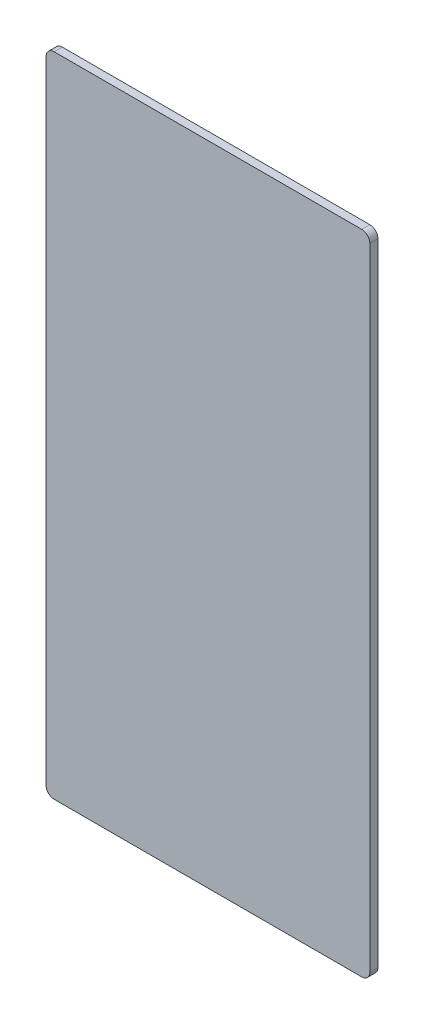
ISO-10303-21;
HEADER;
FILE_DESCRIPTION(('STEP AP214'),'2;1');
FILE_NAME('part.step','',(''),(''),'','','');
FILE_SCHEMA(('AUTOMOTIVE_DESIGN { 1 0 10303 214 1 1 1 1 }'));
ENDSEC;
DATA;
#1=APPLICATION_CONTEXT('core data for automotive mechanical design processes');
#2=APPLICATION_PROTOCOL_DEFINITION('international standard','automotive_design',2000,#1);
#3=PRODUCT_CONTEXT('',#1,'mechanical');
#4=PRODUCT('Part','Part','',(#3));
#5=PRODUCT_RELATED_PRODUCT_CATEGORY('part','',(#4));
#6=PRODUCT_DEFINITION_FORMATION('','',#4);
#7=PRODUCT_DEFINITION_CONTEXT('part definition',#1,'design');
#8=PRODUCT_DEFINITION('design','',#6,#7);
#9=PRODUCT_DEFINITION_SHAPE('','',#8);
#10=(LENGTH_UNIT() NAMED_UNIT(*) SI_UNIT(.MILLI.,.METRE.));
#11=(NAMED_UNIT(*) PLANE_ANGLE_UNIT() SI_UNIT($,.RADIAN.));
#12=(NAMED_UNIT(*) SI_UNIT($,.STERADIAN.) SOLID_ANGLE_UNIT());
#13=UNCERTAINTY_MEASURE_WITH_UNIT(LENGTH_MEASURE(1.E-05),#10,'distance_accuracy_value','');
#14=(GEOMETRIC_REPRESENTATION_CONTEXT(3) GLOBAL_UNCERTAINTY_ASSIGNED_CONTEXT((#13)) GLOBAL_UNIT_ASSIGNED_CONTEXT((#10,
#11,#12)) REPRESENTATION_CONTEXT('',''));
#15=CARTESIAN_POINT('',(0.,0.,0.));
#16=DIRECTION('',(0.,0.,1.));
#17=DIRECTION('',(1.,0.,0.));
#18=AXIS2_PLACEMENT_3D('',#15,#16,#17);
#19=CARTESIAN_POINT('',(10.,-20.,0.5));
#20=DIRECTION('',(-1.,0.,0.));
#21=DIRECTION('',(0.,0.,1.));
#22=AXIS2_PLACEMENT_3D('',#19,#20,#21);
#23=PLANE('',#22);
#24=DIRECTION('',(0.,1.,0.));
#25=VECTOR('',#24,1.);
#26=CARTESIAN_POINT('',(10.,-20.,0.));
#27=LINE('',#26,#25);
#28=CARTESIAN_POINT('',(10.,-19.5,0.));
#29=VERTEX_POINT('',#28);
#30=CARTESIAN_POINT('',(10.,19.5,0.));
#31=VERTEX_POINT('',#30);
#32=EDGE_CURVE('E155',#29,#31,#27,.T.);
#33=ORIENTED_EDGE('',*,*,#32,.T.);
#34=DIRECTION('',(0.,0.,-1.));
#35=VECTOR('',#34,1.);
#36=CARTESIAN_POINT('',(10.,19.5,0.5));
#37=LINE('',#36,#35);
#38=CARTESIAN_POINT('',(10.,19.5,0.5));
#39=VERTEX_POINT('',#38);
#40=EDGE_CURVE('E197',#31,#39,#37,.F.);
#41=ORIENTED_EDGE('',*,*,#40,.T.);
#42=DIRECTION('',(0.,1.,0.));
#43=VECTOR('',#42,1.);
#44=CARTESIAN_POINT('',(10.,-20.,0.5));
#45=LINE('',#44,#43);
#46=CARTESIAN_POINT('',(10.,-19.5,0.5));
#47=VERTEX_POINT('',#46);
#48=EDGE_CURVE('E164',#47,#39,#45,.T.);
#49=ORIENTED_EDGE('',*,*,#48,.F.);
#50=DIRECTION('',(0.,0.,-1.));
#51=VECTOR('',#50,1.);
#52=CARTESIAN_POINT('',(10.,-19.5,0.5));
#53=LINE('',#52,#51);
#54=EDGE_CURVE('E194',#47,#29,#53,.T.);
#55=ORIENTED_EDGE('',*,*,#54,.T.);
#56=EDGE_LOOP('',(#33,#41,#49,#55));
#57=FACE_BOUND('',#56,.T.);
#58=ADVANCED_FACE('F41',(#57),#23,.F.);
#59=CARTESIAN_POINT('',(-10.,20.,0.5));
#60=DIRECTION('',(0.,-1.,0.));
#61=DIRECTION('',(0.,0.,-1.));
#62=AXIS2_PLACEMENT_3D('',#59,#60,#61);
#63=PLANE('',#62);
#64=DIRECTION('',(-1.,0.,0.));
#65=VECTOR('',#64,1.);
#66=CARTESIAN_POINT('',(-10.,20.,0.5));
#67=LINE('',#66,#65);
#68=CARTESIAN_POINT('',(9.5,20.,0.5));
#69=VERTEX_POINT('',#68);
#70=CARTESIAN_POINT('',(-9.5,20.,0.5));
#71=VERTEX_POINT('',#70);
#72=EDGE_CURVE('E167',#69,#71,#67,.T.);
#73=ORIENTED_EDGE('',*,*,#72,.F.);
#74=DIRECTION('',(0.,0.,-1.));
#75=VECTOR('',#74,1.);
#76=CARTESIAN_POINT('',(9.5,20.,0.5));
#77=LINE('',#76,#75);
#78=CARTESIAN_POINT('',(9.5,20.,0.));
#79=VERTEX_POINT('',#78);
#80=EDGE_CURVE('E183',#69,#79,#77,.T.);
#81=ORIENTED_EDGE('',*,*,#80,.T.);
#82=DIRECTION('',(-1.,0.,0.));
#83=VECTOR('',#82,1.);
#84=CARTESIAN_POINT('',(-10.,20.,0.));
#85=LINE('',#84,#83);
#86=CARTESIAN_POINT('',(-9.5,20.,0.));
#87=VERTEX_POINT('',#86);
#88=EDGE_CURVE('E158',#79,#87,#85,.T.);
#89=ORIENTED_EDGE('',*,*,#88,.T.);
#90=DIRECTION('',(0.,0.,-1.));
#91=VECTOR('',#90,1.);
#92=CARTESIAN_POINT('',(-9.5,20.,0.5));
#93=LINE('',#92,#91);
#94=EDGE_CURVE('E174',#87,#71,#93,.F.);
#95=ORIENTED_EDGE('',*,*,#94,.T.);
#96=EDGE_LOOP('',(#73,#81,#89,#95));
#97=FACE_BOUND('',#96,.T.);
#98=ADVANCED_FACE('F234',(#97),#63,.F.);
#99=CARTESIAN_POINT('',(-10.,-20.,0.5));
#100=DIRECTION('',(1.,0.,0.));
#101=DIRECTION('',(0.,0.,-1.));
#102=AXIS2_PLACEMENT_3D('',#99,#100,#101);
#103=PLANE('',#102);
#104=DIRECTION('',(0.,-1.,0.));
#105=VECTOR('',#104,1.);
#106=CARTESIAN_POINT('',(-10.,-20.,0.5));
#107=LINE('',#106,#105);
#108=CARTESIAN_POINT('',(-10.,19.5,0.5));
#109=VERTEX_POINT('',#108);
#110=CARTESIAN_POINT('',(-10.,-19.5,0.5));
#111=VERTEX_POINT('',#110);
#112=EDGE_CURVE('E171',#109,#111,#107,.T.);
#113=ORIENTED_EDGE('',*,*,#112,.F.);
#114=DIRECTION('',(0.,0.,-1.));
#115=VECTOR('',#114,1.);
#116=CARTESIAN_POINT('',(-10.,19.5,0.5));
#117=LINE('',#116,#115);
#118=CARTESIAN_POINT('',(-10.,19.5,0.));
#119=VERTEX_POINT('',#118);
#120=EDGE_CURVE('E208',#109,#119,#117,.T.);
#121=ORIENTED_EDGE('',*,*,#120,.T.);
#122=DIRECTION('',(0.,-1.,0.));
#123=VECTOR('',#122,1.);
#124=CARTESIAN_POINT('',(-10.,-20.,0.));
#125=LINE('',#124,#123);
#126=CARTESIAN_POINT('',(-10.,-19.5,0.));
#127=VERTEX_POINT('',#126);
#128=EDGE_CURVE('E178',#119,#127,#125,.T.);
#129=ORIENTED_EDGE('',*,*,#128,.T.);
#130=DIRECTION('',(0.,0.,-1.));
#131=VECTOR('',#130,1.);
#132=CARTESIAN_POINT('',(-10.,-19.5,0.5));
#133=LINE('',#132,#131);
#134=EDGE_CURVE('E206',#127,#111,#133,.F.);
#135=ORIENTED_EDGE('',*,*,#134,.T.);
#136=EDGE_LOOP('',(#113,#121,#129,#135));
#137=FACE_BOUND('',#136,.T.);
#138=ADVANCED_FACE('F242',(#137),#103,.F.);
#139=CARTESIAN_POINT('',(-10.,-20.,0.5));
#140=DIRECTION('',(0.,1.,0.));
#141=DIRECTION('',(0.,0.,1.));
#142=AXIS2_PLACEMENT_3D('',#139,#140,#141);
#143=PLANE('',#142);
#144=DIRECTION('',(1.,0.,0.));
#145=VECTOR('',#144,1.);
#146=CARTESIAN_POINT('',(-10.,-20.,0.));
#147=LINE('',#146,#145);
#148=CARTESIAN_POINT('',(-9.5,-20.,0.));
#149=VERTEX_POINT('',#148);
#150=CARTESIAN_POINT('',(9.5,-20.,0.));
#151=VERTEX_POINT('',#150);
#152=EDGE_CURVE('E168',#149,#151,#147,.T.);
#153=ORIENTED_EDGE('',*,*,#152,.T.);
#154=DIRECTION('',(0.,0.,-1.));
#155=VECTOR('',#154,1.);
#156=CARTESIAN_POINT('',(9.5,-20.,0.5));
#157=LINE('',#156,#155);
#158=CARTESIAN_POINT('',(9.5,-20.,0.5));
#159=VERTEX_POINT('',#158);
#160=EDGE_CURVE('E11',#151,#159,#157,.F.);
#161=ORIENTED_EDGE('',*,*,#160,.T.);
#162=DIRECTION('',(1.,0.,0.));
#163=VECTOR('',#162,1.);
#164=CARTESIAN_POINT('',(-10.,-20.,0.5));
#165=LINE('',#164,#163);
#166=CARTESIAN_POINT('',(-9.5,-20.,0.5));
#167=VERTEX_POINT('',#166);
#168=EDGE_CURVE('E173',#167,#159,#165,.T.);
#169=ORIENTED_EDGE('',*,*,#168,.F.);
#170=DIRECTION('',(0.,0.,-1.));
#171=VECTOR('',#170,1.);
#172=CARTESIAN_POINT('',(-9.5,-20.,0.5));
#173=LINE('',#172,#171);
#174=EDGE_CURVE('E49',#167,#149,#173,.T.);
#175=ORIENTED_EDGE('',*,*,#174,.T.);
#176=EDGE_LOOP('',(#153,#161,#169,#175));
#177=FACE_BOUND('',#176,.T.);
#178=ADVANCED_FACE('F213',(#177),#143,.F.);
#179=CARTESIAN_POINT('',(0.,0.,0.5));
#180=DIRECTION('',(0.,0.,-1.));
#181=DIRECTION('',(-1.,0.,0.));
#182=AXIS2_PLACEMENT_3D('',#179,#180,#181);
#183=PLANE('',#182);
#184=ORIENTED_EDGE('',*,*,#48,.T.);
#185=CARTESIAN_POINT('',(9.5,19.5,0.5));
#186=DIRECTION('',(0.,0.,-1.));
#187=DIRECTION('',(-1.,0.,0.));
#188=AXIS2_PLACEMENT_3D('',#185,#186,#187);
#189=CIRCLE('',#188,0.5);
#190=EDGE_CURVE('E204',#39,#69,#189,.F.);
#191=ORIENTED_EDGE('',*,*,#190,.T.);
#192=ORIENTED_EDGE('',*,*,#72,.T.);
#193=CARTESIAN_POINT('',(-9.5,19.5,0.5));
#194=DIRECTION('',(0.,0.,-1.));
#195=DIRECTION('',(-1.,0.,0.));
#196=AXIS2_PLACEMENT_3D('',#193,#194,#195);
#197=CIRCLE('',#196,0.5);
#198=EDGE_CURVE('E202',#71,#109,#197,.F.);
#199=ORIENTED_EDGE('',*,*,#198,.T.);
#200=ORIENTED_EDGE('',*,*,#112,.T.);
#201=CARTESIAN_POINT('',(-9.5,-19.5,0.5));
#202=DIRECTION('',(0.,0.,-1.));
#203=DIRECTION('',(-1.,0.,0.));
#204=AXIS2_PLACEMENT_3D('',#201,#202,#203);
#205=CIRCLE('',#204,0.5);
#206=EDGE_CURVE('E61',#111,#167,#205,.F.);
#207=ORIENTED_EDGE('',*,*,#206,.T.);
#208=ORIENTED_EDGE('',*,*,#168,.T.);
#209=CARTESIAN_POINT('',(9.5,-19.5,0.5));
#210=DIRECTION('',(0.,0.,-1.));
#211=DIRECTION('',(-1.,0.,0.));
#212=AXIS2_PLACEMENT_3D('',#209,#210,#211);
#213=CIRCLE('',#212,0.5);
#214=EDGE_CURVE('E200',#159,#47,#213,.F.);
#215=ORIENTED_EDGE('',*,*,#214,.T.);
#216=EDGE_LOOP('',(#184,#191,#192,#199,#200,#207,#208,#215));
#217=FACE_BOUND('',#216,.T.);
#218=ADVANCED_FACE('F228',(#217),#183,.F.);
#219=CARTESIAN_POINT('',(0.,0.,0.));
#220=DIRECTION('',(0.,0.,-1.));
#221=DIRECTION('',(-1.,0.,0.));
#222=AXIS2_PLACEMENT_3D('',#219,#220,#221);
#223=PLANE('',#222);
#224=DIRECTION('',(0.,1.,0.));
#225=VECTOR('',#224,1.);
#226=CARTESIAN_POINT('',(-9.,-19.,0.));
#227=LINE('',#226,#225);
#228=CARTESIAN_POINT('',(-9.,-19.,0.));
#229=VERTEX_POINT('',#228);
#230=CARTESIAN_POINT('',(-9.,19.,0.));
#231=VERTEX_POINT('',#230);
#232=EDGE_CURVE('E154',#229,#231,#227,.T.);
#233=ORIENTED_EDGE('',*,*,#232,.F.);
#234=DIRECTION('',(-1.,0.,0.));
#235=VECTOR('',#234,1.);
#236=CARTESIAN_POINT('',(9.,-19.,0.));
#237=LINE('',#236,#235);
#238=CARTESIAN_POINT('',(9.,-19.,0.));
#239=VERTEX_POINT('',#238);
#240=EDGE_CURVE('E151',#239,#229,#237,.T.);
#241=ORIENTED_EDGE('',*,*,#240,.F.);
#242=DIRECTION('',(0.,-1.,0.));
#243=VECTOR('',#242,1.);
#244=CARTESIAN_POINT('',(9.,-19.,0.));
#245=LINE('',#244,#243);
#246=CARTESIAN_POINT('',(9.,19.,0.));
#247=VERTEX_POINT('',#246);
#248=EDGE_CURVE('E369',#247,#239,#245,.T.);
#249=ORIENTED_EDGE('',*,*,#248,.F.);
#250=DIRECTION('',(1.,0.,0.));
#251=VECTOR('',#250,1.);
#252=CARTESIAN_POINT('',(9.,19.,0.));
#253=LINE('',#252,#251);
#254=EDGE_CURVE('E364',#231,#247,#253,.T.);
#255=ORIENTED_EDGE('',*,*,#254,.F.);
#256=EDGE_LOOP('',(#233,#241,#249,#255));
#257=FACE_BOUND('',#256,.T.);
#258=ORIENTED_EDGE('',*,*,#88,.F.);
#259=CARTESIAN_POINT('',(9.5,19.5,0.));
#260=DIRECTION('',(0.,0.,-1.));
#261=DIRECTION('',(-1.,0.,0.));
#262=AXIS2_PLACEMENT_3D('',#259,#260,#261);
#263=CIRCLE('',#262,0.5);
#264=EDGE_CURVE('E192',#79,#31,#263,.T.);
#265=ORIENTED_EDGE('',*,*,#264,.T.);
#266=ORIENTED_EDGE('',*,*,#32,.F.);
#267=CARTESIAN_POINT('',(9.5,-19.5,0.));
#268=DIRECTION('',(0.,0.,-1.));
#269=DIRECTION('',(-1.,0.,0.));
#270=AXIS2_PLACEMENT_3D('',#267,#268,#269);
#271=CIRCLE('',#270,0.5);
#272=EDGE_CURVE('E188',#29,#151,#271,.T.);
#273=ORIENTED_EDGE('',*,*,#272,.T.);
#274=ORIENTED_EDGE('',*,*,#152,.F.);
#275=CARTESIAN_POINT('',(-9.5,-19.5,0.));
#276=DIRECTION('',(0.,0.,-1.));
#277=DIRECTION('',(-1.,0.,0.));
#278=AXIS2_PLACEMENT_3D('',#275,#276,#277);
#279=CIRCLE('',#278,0.5);
#280=EDGE_CURVE('E186',#149,#127,#279,.T.);
#281=ORIENTED_EDGE('',*,*,#280,.T.);
#282=ORIENTED_EDGE('',*,*,#128,.F.);
#283=CARTESIAN_POINT('',(-9.5,19.5,0.));
#284=DIRECTION('',(0.,0.,-1.));
#285=DIRECTION('',(-1.,0.,0.));
#286=AXIS2_PLACEMENT_3D('',#283,#284,#285);
#287=CIRCLE('',#286,0.5);
#288=EDGE_CURVE('E190',#119,#87,#287,.T.);
#289=ORIENTED_EDGE('',*,*,#288,.T.);
#290=EDGE_LOOP('',(#258,#265,#266,#273,#274,#281,#282,#289));
#291=FACE_BOUND('',#290,.T.);
#292=ADVANCED_FACE('F217',(#257,#291),#223,.T.);
#293=CARTESIAN_POINT('',(-9.,-19.,-0.5));
#294=DIRECTION('',(1.,0.,0.));
#295=DIRECTION('',(0.,0.,-1.));
#296=AXIS2_PLACEMENT_3D('',#293,#294,#295);
#297=PLANE('',#296);
#298=ORIENTED_EDGE('',*,*,#232,.T.);
#299=DIRECTION('',(0.,0.,1.));
#300=VECTOR('',#299,1.);
#301=CARTESIAN_POINT('',(-9.,19.,-0.5));
#302=LINE('',#301,#300);
#303=CARTESIAN_POINT('',(-9.,19.,-0.5));
#304=VERTEX_POINT('',#303);
#305=EDGE_CURVE('E135',#304,#231,#302,.T.);
#306=ORIENTED_EDGE('',*,*,#305,.F.);
#307=DIRECTION('',(0.,1.,0.));
#308=VECTOR('',#307,1.);
#309=CARTESIAN_POINT('',(-9.,-19.,-0.5));
#310=LINE('',#309,#308);
#311=CARTESIAN_POINT('',(-9.,-19.,-0.5));
#312=VERTEX_POINT('',#311);
#313=EDGE_CURVE('E142',#312,#304,#310,.T.);
#314=ORIENTED_EDGE('',*,*,#313,.F.);
#315=DIRECTION('',(0.,0.,1.));
#316=VECTOR('',#315,1.);
#317=CARTESIAN_POINT('',(-9.,-19.,-0.5));
#318=LINE('',#317,#316);
#319=EDGE_CURVE('E367',#312,#229,#318,.T.);
#320=ORIENTED_EDGE('',*,*,#319,.T.);
#321=EDGE_LOOP('',(#298,#306,#314,#320));
#322=FACE_BOUND('',#321,.T.);
#323=ADVANCED_FACE('F153',(#322),#297,.F.);
#324=CARTESIAN_POINT('',(9.,19.,-0.5));
#325=DIRECTION('',(0.,-1.,0.));
#326=DIRECTION('',(0.,0.,-1.));
#327=AXIS2_PLACEMENT_3D('',#324,#325,#326);
#328=PLANE('',#327);
#329=ORIENTED_EDGE('',*,*,#254,.T.);
#330=DIRECTION('',(0.,0.,1.));
#331=VECTOR('',#330,1.);
#332=CARTESIAN_POINT('',(9.,19.,-0.5));
#333=LINE('',#332,#331);
#334=CARTESIAN_POINT('',(9.,19.,-0.5));
#335=VERTEX_POINT('',#334);
#336=EDGE_CURVE('E138',#335,#247,#333,.T.);
#337=ORIENTED_EDGE('',*,*,#336,.F.);
#338=DIRECTION('',(1.,0.,0.));
#339=VECTOR('',#338,1.);
#340=CARTESIAN_POINT('',(9.,19.,-0.5));
#341=LINE('',#340,#339);
#342=EDGE_CURVE('E130',#304,#335,#341,.T.);
#343=ORIENTED_EDGE('',*,*,#342,.F.);
#344=ORIENTED_EDGE('',*,*,#305,.T.);
#345=EDGE_LOOP('',(#329,#337,#343,#344));
#346=FACE_BOUND('',#345,.T.);
#347=ADVANCED_FACE('F133',(#346),#328,.F.);
#348=CARTESIAN_POINT('',(9.,-19.,-0.5));
#349=DIRECTION('',(-1.,0.,0.));
#350=DIRECTION('',(0.,0.,1.));
#351=AXIS2_PLACEMENT_3D('',#348,#349,#350);
#352=PLANE('',#351);
#353=ORIENTED_EDGE('',*,*,#248,.T.);
#354=DIRECTION('',(0.,0.,1.));
#355=VECTOR('',#354,1.);
#356=CARTESIAN_POINT('',(9.,-19.,-0.5));
#357=LINE('',#356,#355);
#358=CARTESIAN_POINT('',(9.,-19.,-0.5));
#359=VERTEX_POINT('',#358);
#360=EDGE_CURVE('E160',#359,#239,#357,.T.);
#361=ORIENTED_EDGE('',*,*,#360,.F.);
#362=DIRECTION('',(0.,-1.,0.));
#363=VECTOR('',#362,1.);
#364=CARTESIAN_POINT('',(9.,-19.,-0.5));
#365=LINE('',#364,#363);
#366=EDGE_CURVE('E141',#335,#359,#365,.T.);
#367=ORIENTED_EDGE('',*,*,#366,.F.);
#368=ORIENTED_EDGE('',*,*,#336,.T.);
#369=EDGE_LOOP('',(#353,#361,#367,#368));
#370=FACE_BOUND('',#369,.T.);
#371=ADVANCED_FACE('F295',(#370),#352,.F.);
#372=CARTESIAN_POINT('',(9.,-19.,-0.5));
#373=DIRECTION('',(0.,1.,0.));
#374=DIRECTION('',(0.,0.,1.));
#375=AXIS2_PLACEMENT_3D('',#372,#373,#374);
#376=PLANE('',#375);
#377=ORIENTED_EDGE('',*,*,#240,.T.);
#378=ORIENTED_EDGE('',*,*,#319,.F.);
#379=DIRECTION('',(-1.,0.,0.));
#380=VECTOR('',#379,1.);
#381=CARTESIAN_POINT('',(9.,-19.,-0.5));
#382=LINE('',#381,#380);
#383=EDGE_CURVE('E147',#359,#312,#382,.T.);
#384=ORIENTED_EDGE('',*,*,#383,.F.);
#385=ORIENTED_EDGE('',*,*,#360,.T.);
#386=EDGE_LOOP('',(#377,#378,#384,#385));
#387=FACE_BOUND('',#386,.T.);
#388=ADVANCED_FACE('F287',(#387),#376,.F.);
#389=CARTESIAN_POINT('',(0.,0.,-0.5));
#390=DIRECTION('',(0.,0.,1.));
#391=DIRECTION('',(1.,0.,0.));
#392=AXIS2_PLACEMENT_3D('',#389,#390,#391);
#393=PLANE('',#392);
#394=ORIENTED_EDGE('',*,*,#313,.T.);
#395=ORIENTED_EDGE('',*,*,#342,.T.);
#396=ORIENTED_EDGE('',*,*,#366,.T.);
#397=ORIENTED_EDGE('',*,*,#383,.T.);
#398=EDGE_LOOP('',(#394,#395,#396,#397));
#399=FACE_BOUND('',#398,.T.);
#400=ADVANCED_FACE('F145',(#399),#393,.F.);
#401=CARTESIAN_POINT('',(9.5,19.5,0.5));
#402=DIRECTION('',(0.,0.,-1.));
#403=DIRECTION('',(-1.,0.,0.));
#404=AXIS2_PLACEMENT_3D('',#401,#402,#403);
#405=CYLINDRICAL_SURFACE('',#404,0.5);
#406=ORIENTED_EDGE('',*,*,#190,.F.);
#407=ORIENTED_EDGE('',*,*,#40,.F.);
#408=ORIENTED_EDGE('',*,*,#264,.F.);
#409=ORIENTED_EDGE('',*,*,#80,.F.);
#410=EDGE_LOOP('',(#406,#407,#408,#409));
#411=FACE_BOUND('',#410,.T.);
#412=ADVANCED_FACE('F232',(#411),#405,.T.);
#413=CARTESIAN_POINT('',(-9.5,19.5,0.5));
#414=DIRECTION('',(0.,0.,-1.));
#415=DIRECTION('',(-1.,0.,0.));
#416=AXIS2_PLACEMENT_3D('',#413,#414,#415);
#417=CYLINDRICAL_SURFACE('',#416,0.5);
#418=ORIENTED_EDGE('',*,*,#198,.F.);
#419=ORIENTED_EDGE('',*,*,#94,.F.);
#420=ORIENTED_EDGE('',*,*,#288,.F.);
#421=ORIENTED_EDGE('',*,*,#120,.F.);
#422=EDGE_LOOP('',(#418,#419,#420,#421));
#423=FACE_BOUND('',#422,.T.);
#424=ADVANCED_FACE('F239',(#423),#417,.T.);
#425=CARTESIAN_POINT('',(9.5,-19.5,0.5));
#426=DIRECTION('',(0.,0.,-1.));
#427=DIRECTION('',(-1.,0.,0.));
#428=AXIS2_PLACEMENT_3D('',#425,#426,#427);
#429=CYLINDRICAL_SURFACE('',#428,0.5);
#430=ORIENTED_EDGE('',*,*,#214,.F.);
#431=ORIENTED_EDGE('',*,*,#160,.F.);
#432=ORIENTED_EDGE('',*,*,#272,.F.);
#433=ORIENTED_EDGE('',*,*,#54,.F.);
#434=EDGE_LOOP('',(#430,#431,#432,#433));
#435=FACE_BOUND('',#434,.T.);
#436=ADVANCED_FACE('F223',(#435),#429,.T.);
#437=CARTESIAN_POINT('',(-9.5,-19.5,0.5));
#438=DIRECTION('',(0.,0.,-1.));
#439=DIRECTION('',(-1.,0.,0.));
#440=AXIS2_PLACEMENT_3D('',#437,#438,#439);
#441=CYLINDRICAL_SURFACE('',#440,0.5);
#442=ORIENTED_EDGE('',*,*,#206,.F.);
#443=ORIENTED_EDGE('',*,*,#134,.F.);
#444=ORIENTED_EDGE('',*,*,#280,.F.);
#445=ORIENTED_EDGE('',*,*,#174,.F.);
#446=EDGE_LOOP('',(#442,#443,#444,#445));
#447=FACE_BOUND('',#446,.T.);
#448=ADVANCED_FACE('F43',(#447),#441,.T.);
#449=CLOSED_SHELL('',(#58,#98,#138,#178,#218,#292,#323,#347,#371,#388,#400,#412,#424,#436,#448));
#450=MANIFOLD_SOLID_BREP('B2',#449);
#451=ADVANCED_BREP_SHAPE_REPRESENTATION('',(#18,#450),#14);
#452=SHAPE_DEFINITION_REPRESENTATION(#9,#451);
ENDSEC;
END-ISO-10303-21;
